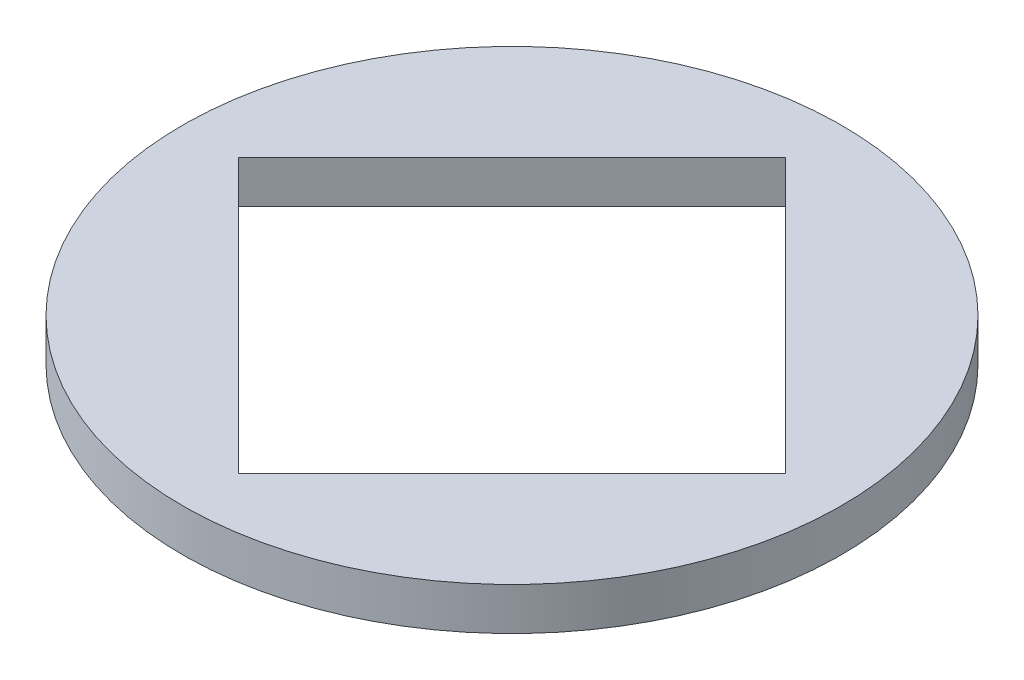
ISO-10303-21;
HEADER;
FILE_DESCRIPTION(('STEP AP214'),'2;1');
FILE_NAME('part.step','',(''),(''),'','','');
FILE_SCHEMA(('AUTOMOTIVE_DESIGN { 1 0 10303 214 1 1 1 1 }'));
ENDSEC;
DATA;
#1=APPLICATION_CONTEXT('core data for automotive mechanical design processes');
#2=APPLICATION_PROTOCOL_DEFINITION('international standard','automotive_design',2000,#1);
#3=PRODUCT_CONTEXT('',#1,'mechanical');
#4=PRODUCT('Part','Part','',(#3));
#5=PRODUCT_RELATED_PRODUCT_CATEGORY('part','',(#4));
#6=PRODUCT_DEFINITION_FORMATION('','',#4);
#7=PRODUCT_DEFINITION_CONTEXT('part definition',#1,'design');
#8=PRODUCT_DEFINITION('design','',#6,#7);
#9=PRODUCT_DEFINITION_SHAPE('','',#8);
#10=(LENGTH_UNIT() NAMED_UNIT(*) SI_UNIT(.MILLI.,.METRE.));
#11=(NAMED_UNIT(*) PLANE_ANGLE_UNIT() SI_UNIT($,.RADIAN.));
#12=(NAMED_UNIT(*) SI_UNIT($,.STERADIAN.) SOLID_ANGLE_UNIT());
#13=UNCERTAINTY_MEASURE_WITH_UNIT(LENGTH_MEASURE(1.E-05),#10,'distance_accuracy_value','');
#14=(GEOMETRIC_REPRESENTATION_CONTEXT(3) GLOBAL_UNCERTAINTY_ASSIGNED_CONTEXT((#13)) GLOBAL_UNIT_ASSIGNED_CONTEXT((#10,
#11,#12)) REPRESENTATION_CONTEXT('',''));
#15=CARTESIAN_POINT('',(0.,0.,0.));
#16=DIRECTION('',(0.,0.,1.));
#17=DIRECTION('',(1.,0.,0.));
#18=AXIS2_PLACEMENT_3D('',#15,#16,#17);
#19=CARTESIAN_POINT('',(-9.34165997526477,18.23693997096,54.1271242589921));
#20=DIRECTION('',(0.707106781186549,0.,0.707106781186546));
#21=DIRECTION('',(0.,-1.,0.));
#22=AXIS2_PLACEMENT_3D('',#19,#20,#21);
#23=PLANE('',#22);
#24=DIRECTION('',(0.707106781186546,0.,-0.707106781186549));
#25=VECTOR('',#24,1.);
#26=CARTESIAN_POINT('',(-9.34165997526477,19.23693997096,54.1271242589921));
#27=LINE('',#26,#25);
#28=CARTESIAN_POINT('',(-9.34165997526477,19.23693997096,54.1271242589921));
#29=VERTEX_POINT('',#28);
#30=CARTESIAN_POINT('',(-2.90698826646721,19.23693997096,47.6924525501945));
#31=VERTEX_POINT('',#30);
#32=EDGE_CURVE('E85',#29,#31,#27,.T.);
#33=ORIENTED_EDGE('',*,*,#32,.F.);
#34=DIRECTION('',(0.,1.,0.));
#35=VECTOR('',#34,1.);
#36=CARTESIAN_POINT('',(-9.34165997526477,18.23693997096,54.1271242589921));
#37=LINE('',#36,#35);
#38=CARTESIAN_POINT('',(-9.34165997526477,18.23693997096,54.1271242589921));
#39=VERTEX_POINT('',#38);
#40=EDGE_CURVE('E11',#39,#29,#37,.T.);
#41=ORIENTED_EDGE('',*,*,#40,.F.);
#42=DIRECTION('',(0.707106781186546,0.,-0.707106781186549));
#43=VECTOR('',#42,1.);
#44=CARTESIAN_POINT('',(-9.34165997526477,18.23693997096,54.1271242589921));
#45=LINE('',#44,#43);
#46=CARTESIAN_POINT('',(-2.90698826646721,18.23693997096,47.6924525501945));
#47=VERTEX_POINT('',#46);
#48=EDGE_CURVE('E88',#39,#47,#45,.T.);
#49=ORIENTED_EDGE('',*,*,#48,.T.);
#50=DIRECTION('',(0.,1.,0.));
#51=VECTOR('',#50,1.);
#52=CARTESIAN_POINT('',(-2.90698826646721,18.23693997096,47.6924525501945));
#53=LINE('',#52,#51);
#54=EDGE_CURVE('E83',#47,#31,#53,.T.);
#55=ORIENTED_EDGE('',*,*,#54,.T.);
#56=EDGE_LOOP('',(#33,#41,#49,#55));
#57=FACE_BOUND('',#56,.T.);
#58=ADVANCED_FACE('F16',(#57),#23,.T.);
#59=CARTESIAN_POINT('',(-9.34165997526477,18.23693997096,54.1271242589921));
#60=DIRECTION('',(0.707106781186546,0.,-0.707106781186549));
#61=DIRECTION('',(0.,-1.,0.));
#62=AXIS2_PLACEMENT_3D('',#59,#60,#61);
#63=PLANE('',#62);
#64=DIRECTION('',(-0.707106781186549,0.,-0.707106781186546));
#65=VECTOR('',#64,1.);
#66=CARTESIAN_POINT('',(-9.34165997526477,19.23693997096,54.1271242589921));
#67=LINE('',#66,#65);
#68=CARTESIAN_POINT('',(-2.90698826646718,19.23693997096,60.5617959677896));
#69=VERTEX_POINT('',#68);
#70=EDGE_CURVE('E102',#69,#29,#67,.T.);
#71=ORIENTED_EDGE('',*,*,#70,.F.);
#72=DIRECTION('',(0.,1.,0.));
#73=VECTOR('',#72,1.);
#74=CARTESIAN_POINT('',(-2.90698826646718,18.23693997096,60.5617959677896));
#75=LINE('',#74,#73);
#76=CARTESIAN_POINT('',(-2.90698826646718,18.23693997096,60.5617959677896));
#77=VERTEX_POINT('',#76);
#78=EDGE_CURVE('E24',#77,#69,#75,.T.);
#79=ORIENTED_EDGE('',*,*,#78,.F.);
#80=DIRECTION('',(-0.707106781186549,0.,-0.707106781186546));
#81=VECTOR('',#80,1.);
#82=CARTESIAN_POINT('',(-9.34165997526477,18.23693997096,54.1271242589921));
#83=LINE('',#82,#81);
#84=EDGE_CURVE('E114',#77,#39,#83,.T.);
#85=ORIENTED_EDGE('',*,*,#84,.T.);
#86=ORIENTED_EDGE('',*,*,#40,.T.);
#87=EDGE_LOOP('',(#71,#79,#85,#86));
#88=FACE_BOUND('',#87,.T.);
#89=ADVANCED_FACE('F140',(#88),#63,.T.);
#90=CARTESIAN_POINT('',(-2.90698826646718,18.23693997096,60.5617959677896));
#91=DIRECTION('',(-0.707106781186549,0.,-0.707106781186546));
#92=DIRECTION('',(-0.707106781186546,0.,0.707106781186549));
#93=AXIS2_PLACEMENT_3D('',#90,#91,#92);
#94=PLANE('',#93);
#95=DIRECTION('',(-0.707106781186546,0.,0.707106781186549));
#96=VECTOR('',#95,1.);
#97=CARTESIAN_POINT('',(-2.90698826646718,19.23693997096,60.5617959677896));
#98=LINE('',#97,#96);
#99=CARTESIAN_POINT('',(3.52768344233039,19.23693997096,54.127124258992));
#100=VERTEX_POINT('',#99);
#101=EDGE_CURVE('E107',#100,#69,#98,.T.);
#102=ORIENTED_EDGE('',*,*,#101,.F.);
#103=DIRECTION('',(0.,1.,0.));
#104=VECTOR('',#103,1.);
#105=CARTESIAN_POINT('',(3.52768344233039,18.23693997096,54.127124258992));
#106=LINE('',#105,#104);
#107=CARTESIAN_POINT('',(3.52768344233039,18.23693997096,54.127124258992));
#108=VERTEX_POINT('',#107);
#109=EDGE_CURVE('E94',#108,#100,#106,.T.);
#110=ORIENTED_EDGE('',*,*,#109,.F.);
#111=DIRECTION('',(-0.707106781186546,0.,0.707106781186549));
#112=VECTOR('',#111,1.);
#113=CARTESIAN_POINT('',(-2.90698826646718,18.23693997096,60.5617959677896));
#114=LINE('',#113,#112);
#115=EDGE_CURVE('E130',#108,#77,#114,.T.);
#116=ORIENTED_EDGE('',*,*,#115,.T.);
#117=ORIENTED_EDGE('',*,*,#78,.T.);
#118=EDGE_LOOP('',(#102,#110,#116,#117));
#119=FACE_BOUND('',#118,.T.);
#120=ADVANCED_FACE('F145',(#119),#94,.T.);
#121=CARTESIAN_POINT('',(-2.90698826646721,18.23693997096,47.6924525501945));
#122=DIRECTION('',(-0.707106781186546,0.,0.707106781186549));
#123=DIRECTION('',(0.,1.,0.));
#124=AXIS2_PLACEMENT_3D('',#121,#122,#123);
#125=PLANE('',#124);
#126=DIRECTION('',(0.707106781186549,0.,0.707106781186546));
#127=VECTOR('',#126,1.);
#128=CARTESIAN_POINT('',(-2.90698826646721,19.23693997096,47.6924525501945));
#129=LINE('',#128,#127);
#130=EDGE_CURVE('E101',#31,#100,#129,.T.);
#131=ORIENTED_EDGE('',*,*,#130,.F.);
#132=ORIENTED_EDGE('',*,*,#54,.F.);
#133=DIRECTION('',(0.707106781186549,0.,0.707106781186546));
#134=VECTOR('',#133,1.);
#135=CARTESIAN_POINT('',(-2.90698826646721,18.23693997096,47.6924525501945));
#136=LINE('',#135,#134);
#137=EDGE_CURVE('E133',#47,#108,#136,.T.);
#138=ORIENTED_EDGE('',*,*,#137,.T.);
#139=ORIENTED_EDGE('',*,*,#109,.T.);
#140=EDGE_LOOP('',(#131,#132,#138,#139));
#141=FACE_BOUND('',#140,.T.);
#142=ADVANCED_FACE('F105',(#141),#125,.T.);
#143=CARTESIAN_POINT('',(-2.90698826646719,18.23693997096,54.127124258992));
#144=DIRECTION('',(0.,1.,0.));
#145=DIRECTION('',(0.707106781186546,0.,-0.707106781186549));
#146=AXIS2_PLACEMENT_3D('',#143,#144,#145);
#147=CYLINDRICAL_SURFACE('',#146,7.75);
#148=DIRECTION('',(0.,1.,0.));
#149=VECTOR('',#148,1.);
#150=CARTESIAN_POINT('',(2.57308928772854,18.23693997096,48.6470467047963));
#151=LINE('',#150,#149);
#152=CARTESIAN_POINT('',(2.57308928772854,18.23693997096,48.6470467047963));
#153=VERTEX_POINT('',#152);
#154=CARTESIAN_POINT('',(2.57308928772854,19.23693997096,48.6470467047963));
#155=VERTEX_POINT('',#154);
#156=EDGE_CURVE('E338',#153,#155,#151,.T.);
#157=ORIENTED_EDGE('',*,*,#156,.F.);
#158=CARTESIAN_POINT('',(-2.90698826646719,18.23693997096,54.127124258992));
#159=DIRECTION('',(0.,-1.,0.));
#160=DIRECTION('',(0.707106781186546,0.,-0.707106781186549));
#161=AXIS2_PLACEMENT_3D('',#158,#159,#160);
#162=CIRCLE('',#161,7.75);
#163=CARTESIAN_POINT('',(-8.38706582066292,18.23693997096,59.6072018131878));
#164=VERTEX_POINT('',#163);
#165=EDGE_CURVE('E128',#164,#153,#162,.T.);
#166=ORIENTED_EDGE('',*,*,#165,.F.);
#167=DIRECTION('',(0.,1.,0.));
#168=VECTOR('',#167,1.);
#169=CARTESIAN_POINT('',(-8.38706582066292,18.23693997096,59.6072018131878));
#170=LINE('',#169,#168);
#171=CARTESIAN_POINT('',(-8.38706582066292,19.23693997096,59.6072018131878));
#172=VERTEX_POINT('',#171);
#173=EDGE_CURVE('E126',#164,#172,#170,.T.);
#174=ORIENTED_EDGE('',*,*,#173,.T.);
#175=CARTESIAN_POINT('',(-2.90698826646719,19.23693997096,54.127124258992));
#176=DIRECTION('',(0.,-1.,0.));
#177=DIRECTION('',(0.707106781186546,0.,-0.707106781186549));
#178=AXIS2_PLACEMENT_3D('',#175,#176,#177);
#179=CIRCLE('',#178,7.75);
#180=EDGE_CURVE('E108',#172,#155,#179,.T.);
#181=ORIENTED_EDGE('',*,*,#180,.T.);
#182=EDGE_LOOP('',(#157,#166,#174,#181));
#183=FACE_BOUND('',#182,.T.);
#184=ADVANCED_FACE('F153',(#183),#147,.T.);
#185=CARTESIAN_POINT('',(-2.90698826646719,19.23693997096,54.127124258992));
#186=DIRECTION('',(0.,-1.,0.));
#187=DIRECTION('',(0.,0.,-1.));
#188=AXIS2_PLACEMENT_3D('',#185,#186,#187);
#189=PLANE('',#188);
#190=ORIENTED_EDGE('',*,*,#130,.T.);
#191=ORIENTED_EDGE('',*,*,#101,.T.);
#192=ORIENTED_EDGE('',*,*,#70,.T.);
#193=ORIENTED_EDGE('',*,*,#32,.T.);
#194=EDGE_LOOP('',(#190,#191,#192,#193));
#195=FACE_BOUND('',#194,.T.);
#196=ORIENTED_EDGE('',*,*,#180,.F.);
#197=CARTESIAN_POINT('',(-2.90698826646719,19.23693997096,54.127124258992));
#198=DIRECTION('',(0.,-1.,0.));
#199=DIRECTION('',(0.707106781186546,0.,-0.707106781186549));
#200=AXIS2_PLACEMENT_3D('',#197,#198,#199);
#201=CIRCLE('',#200,7.75);
#202=EDGE_CURVE('E345',#155,#172,#201,.T.);
#203=ORIENTED_EDGE('',*,*,#202,.F.);
#204=EDGE_LOOP('',(#196,#203));
#205=FACE_BOUND('',#204,.T.);
#206=ADVANCED_FACE('F98',(#195,#205),#189,.F.);
#207=CARTESIAN_POINT('',(-2.90698826646719,18.23693997096,54.127124258992));
#208=DIRECTION('',(0.,-1.,0.));
#209=DIRECTION('',(0.,0.,-1.));
#210=AXIS2_PLACEMENT_3D('',#207,#208,#209);
#211=PLANE('',#210);
#212=ORIENTED_EDGE('',*,*,#115,.F.);
#213=ORIENTED_EDGE('',*,*,#137,.F.);
#214=ORIENTED_EDGE('',*,*,#48,.F.);
#215=ORIENTED_EDGE('',*,*,#84,.F.);
#216=EDGE_LOOP('',(#212,#213,#214,#215));
#217=FACE_BOUND('',#216,.T.);
#218=ORIENTED_EDGE('',*,*,#165,.T.);
#219=CARTESIAN_POINT('',(-2.90698826646719,18.23693997096,54.127124258992));
#220=DIRECTION('',(0.,-1.,0.));
#221=DIRECTION('',(0.707106781186546,0.,-0.707106781186549));
#222=AXIS2_PLACEMENT_3D('',#219,#220,#221);
#223=CIRCLE('',#222,7.75);
#224=EDGE_CURVE('E335',#153,#164,#223,.T.);
#225=ORIENTED_EDGE('',*,*,#224,.T.);
#226=EDGE_LOOP('',(#218,#225));
#227=FACE_BOUND('',#226,.T.);
#228=ADVANCED_FACE('F143',(#217,#227),#211,.T.);
#229=CARTESIAN_POINT('',(-2.90698826646719,18.23693997096,54.127124258992));
#230=DIRECTION('',(0.,1.,0.));
#231=DIRECTION('',(0.707106781186546,0.,-0.707106781186549));
#232=AXIS2_PLACEMENT_3D('',#229,#230,#231);
#233=CYLINDRICAL_SURFACE('',#232,7.75);
#234=ORIENTED_EDGE('',*,*,#224,.F.);
#235=ORIENTED_EDGE('',*,*,#156,.T.);
#236=ORIENTED_EDGE('',*,*,#202,.T.);
#237=ORIENTED_EDGE('',*,*,#173,.F.);
#238=EDGE_LOOP('',(#234,#235,#236,#237));
#239=FACE_BOUND('',#238,.T.);
#240=ADVANCED_FACE('F208',(#239),#233,.T.);
#241=CLOSED_SHELL('',(#58,#89,#120,#142,#184,#206,#228,#240));
#242=MANIFOLD_SOLID_BREP('B1',#241);
#243=ADVANCED_BREP_SHAPE_REPRESENTATION('',(#18,#242),#14);
#244=SHAPE_DEFINITION_REPRESENTATION(#9,#243);
ENDSEC;
END-ISO-10303-21;
